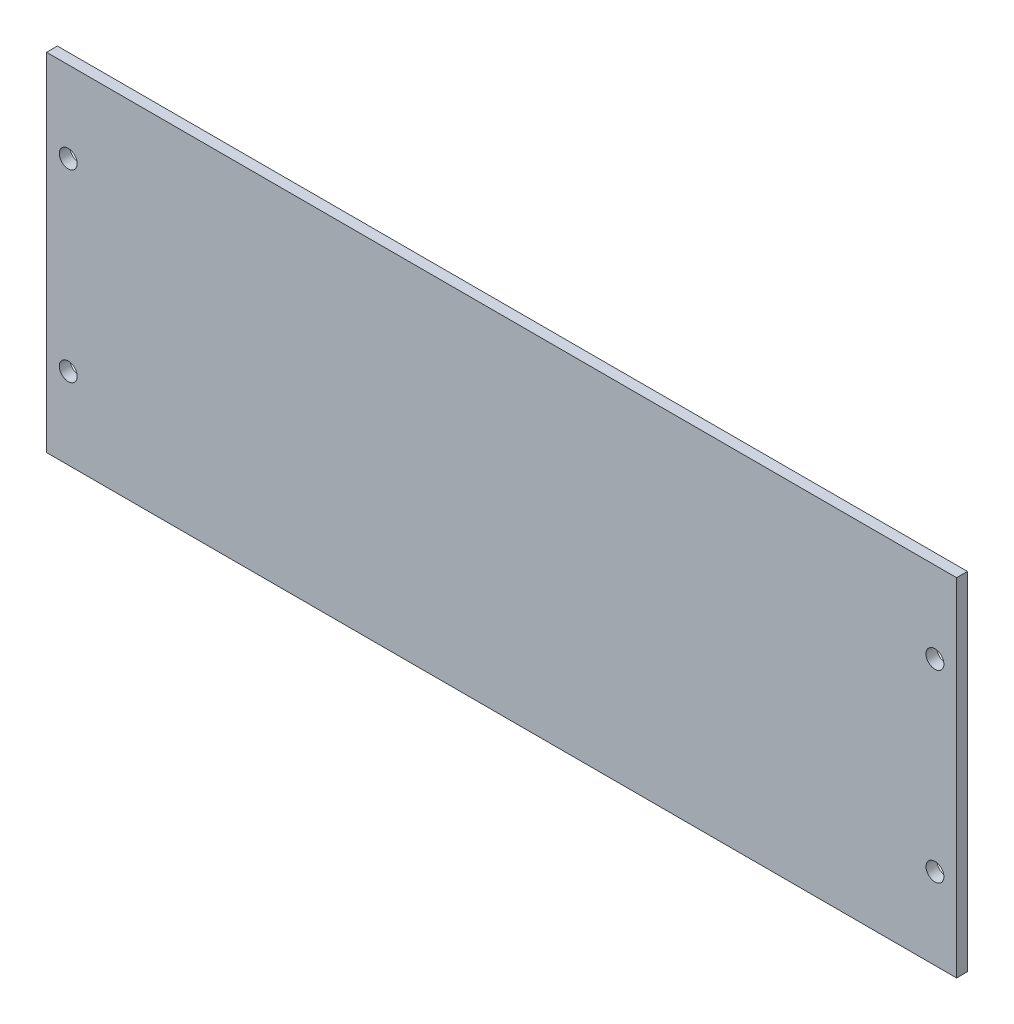
ISO-10303-21;
HEADER;
FILE_DESCRIPTION(('STEP AP214'),'2;1');
FILE_NAME('part.step','',(''),(''),'','','');
FILE_SCHEMA(('AUTOMOTIVE_DESIGN { 1 0 10303 214 1 1 1 1 }'));
ENDSEC;
DATA;
#1=APPLICATION_CONTEXT('core data for automotive mechanical design processes');
#2=APPLICATION_PROTOCOL_DEFINITION('international standard','automotive_design',2000,#1);
#3=PRODUCT_CONTEXT('',#1,'mechanical');
#4=PRODUCT('Part','Part','',(#3));
#5=PRODUCT_RELATED_PRODUCT_CATEGORY('part','',(#4));
#6=PRODUCT_DEFINITION_FORMATION('','',#4);
#7=PRODUCT_DEFINITION_CONTEXT('part definition',#1,'design');
#8=PRODUCT_DEFINITION('design','',#6,#7);
#9=PRODUCT_DEFINITION_SHAPE('','',#8);
#10=(LENGTH_UNIT() NAMED_UNIT(*) SI_UNIT(.MILLI.,.METRE.));
#11=(NAMED_UNIT(*) PLANE_ANGLE_UNIT() SI_UNIT($,.RADIAN.));
#12=(NAMED_UNIT(*) SI_UNIT($,.STERADIAN.) SOLID_ANGLE_UNIT());
#13=UNCERTAINTY_MEASURE_WITH_UNIT(LENGTH_MEASURE(1.E-05),#10,'distance_accuracy_value','');
#14=(GEOMETRIC_REPRESENTATION_CONTEXT(3) GLOBAL_UNCERTAINTY_ASSIGNED_CONTEXT((#13)) GLOBAL_UNIT_ASSIGNED_CONTEXT((#10,
#11,#12)) REPRESENTATION_CONTEXT('',''));
#15=CARTESIAN_POINT('',(0.,0.,0.));
#16=DIRECTION('',(0.,0.,1.));
#17=DIRECTION('',(1.,0.,0.));
#18=AXIS2_PLACEMENT_3D('',#15,#16,#17);
#19=CARTESIAN_POINT('',(168.,-64.,4.));
#20=DIRECTION('',(-1.,0.,0.));
#21=DIRECTION('',(0.,0.,1.));
#22=AXIS2_PLACEMENT_3D('',#19,#20,#21);
#23=PLANE('',#22);
#24=DIRECTION('',(0.,1.,0.));
#25=VECTOR('',#24,1.);
#26=CARTESIAN_POINT('',(168.,-64.,0.));
#27=LINE('',#26,#25);
#28=CARTESIAN_POINT('',(168.,-64.,0.));
#29=VERTEX_POINT('',#28);
#30=CARTESIAN_POINT('',(168.,64.,0.));
#31=VERTEX_POINT('',#30);
#32=EDGE_CURVE('E95',#29,#31,#27,.T.);
#33=ORIENTED_EDGE('',*,*,#32,.T.);
#34=DIRECTION('',(0.,0.,-1.));
#35=VECTOR('',#34,1.);
#36=CARTESIAN_POINT('',(168.,64.,4.));
#37=LINE('',#36,#35);
#38=CARTESIAN_POINT('',(168.,64.,4.));
#39=VERTEX_POINT('',#38);
#40=EDGE_CURVE('E11',#39,#31,#37,.T.);
#41=ORIENTED_EDGE('',*,*,#40,.F.);
#42=DIRECTION('',(0.,1.,0.));
#43=VECTOR('',#42,1.);
#44=CARTESIAN_POINT('',(168.,-64.,4.));
#45=LINE('',#44,#43);
#46=CARTESIAN_POINT('',(168.,-64.,4.));
#47=VERTEX_POINT('',#46);
#48=EDGE_CURVE('E83',#47,#39,#45,.T.);
#49=ORIENTED_EDGE('',*,*,#48,.F.);
#50=DIRECTION('',(0.,0.,-1.));
#51=VECTOR('',#50,1.);
#52=CARTESIAN_POINT('',(168.,-64.,4.));
#53=LINE('',#52,#51);
#54=EDGE_CURVE('E91',#47,#29,#53,.T.);
#55=ORIENTED_EDGE('',*,*,#54,.T.);
#56=EDGE_LOOP('',(#33,#41,#49,#55));
#57=FACE_BOUND('',#56,.T.);
#58=ADVANCED_FACE('F32',(#57),#23,.F.);
#59=CARTESIAN_POINT('',(-168.,64.,4.));
#60=DIRECTION('',(0.,-1.,0.));
#61=DIRECTION('',(0.,0.,-1.));
#62=AXIS2_PLACEMENT_3D('',#59,#60,#61);
#63=PLANE('',#62);
#64=DIRECTION('',(-1.,0.,0.));
#65=VECTOR('',#64,1.);
#66=CARTESIAN_POINT('',(-168.,64.,0.));
#67=LINE('',#66,#65);
#68=CARTESIAN_POINT('',(-168.,64.,0.));
#69=VERTEX_POINT('',#68);
#70=EDGE_CURVE('E87',#31,#69,#67,.T.);
#71=ORIENTED_EDGE('',*,*,#70,.T.);
#72=DIRECTION('',(0.,0.,-1.));
#73=VECTOR('',#72,1.);
#74=CARTESIAN_POINT('',(-168.,64.,4.));
#75=LINE('',#74,#73);
#76=CARTESIAN_POINT('',(-168.,64.,4.));
#77=VERTEX_POINT('',#76);
#78=EDGE_CURVE('E40',#77,#69,#75,.T.);
#79=ORIENTED_EDGE('',*,*,#78,.F.);
#80=DIRECTION('',(-1.,0.,0.));
#81=VECTOR('',#80,1.);
#82=CARTESIAN_POINT('',(-168.,64.,4.));
#83=LINE('',#82,#81);
#84=EDGE_CURVE('E78',#39,#77,#83,.T.);
#85=ORIENTED_EDGE('',*,*,#84,.F.);
#86=ORIENTED_EDGE('',*,*,#40,.T.);
#87=EDGE_LOOP('',(#71,#79,#85,#86));
#88=FACE_BOUND('',#87,.T.);
#89=ADVANCED_FACE('F86',(#88),#63,.F.);
#90=CARTESIAN_POINT('',(-168.,-64.,4.));
#91=DIRECTION('',(1.,0.,0.));
#92=DIRECTION('',(0.,0.,-1.));
#93=AXIS2_PLACEMENT_3D('',#90,#91,#92);
#94=PLANE('',#93);
#95=DIRECTION('',(0.,-1.,0.));
#96=VECTOR('',#95,1.);
#97=CARTESIAN_POINT('',(-168.,-64.,0.));
#98=LINE('',#97,#96);
#99=CARTESIAN_POINT('',(-168.,-64.,0.));
#100=VERTEX_POINT('',#99);
#101=EDGE_CURVE('E65',#69,#100,#98,.T.);
#102=ORIENTED_EDGE('',*,*,#101,.T.);
#103=DIRECTION('',(0.,0.,-1.));
#104=VECTOR('',#103,1.);
#105=CARTESIAN_POINT('',(-168.,-64.,4.));
#106=LINE('',#105,#104);
#107=CARTESIAN_POINT('',(-168.,-64.,4.));
#108=VERTEX_POINT('',#107);
#109=EDGE_CURVE('E88',#108,#100,#106,.T.);
#110=ORIENTED_EDGE('',*,*,#109,.F.);
#111=DIRECTION('',(0.,-1.,0.));
#112=VECTOR('',#111,1.);
#113=CARTESIAN_POINT('',(-168.,-64.,4.));
#114=LINE('',#113,#112);
#115=EDGE_CURVE('E81',#77,#108,#114,.T.);
#116=ORIENTED_EDGE('',*,*,#115,.F.);
#117=ORIENTED_EDGE('',*,*,#78,.T.);
#118=EDGE_LOOP('',(#102,#110,#116,#117));
#119=FACE_BOUND('',#118,.T.);
#120=ADVANCED_FACE('F89',(#119),#94,.F.);
#121=CARTESIAN_POINT('',(-168.,-64.,4.));
#122=DIRECTION('',(0.,1.,0.));
#123=DIRECTION('',(0.,0.,1.));
#124=AXIS2_PLACEMENT_3D('',#121,#122,#123);
#125=PLANE('',#124);
#126=DIRECTION('',(1.,0.,0.));
#127=VECTOR('',#126,1.);
#128=CARTESIAN_POINT('',(-168.,-64.,0.));
#129=LINE('',#128,#127);
#130=EDGE_CURVE('E71',#100,#29,#129,.T.);
#131=ORIENTED_EDGE('',*,*,#130,.T.);
#132=ORIENTED_EDGE('',*,*,#54,.F.);
#133=DIRECTION('',(1.,0.,0.));
#134=VECTOR('',#133,1.);
#135=CARTESIAN_POINT('',(-168.,-64.,4.));
#136=LINE('',#135,#134);
#137=EDGE_CURVE('E48',#108,#47,#136,.T.);
#138=ORIENTED_EDGE('',*,*,#137,.F.);
#139=ORIENTED_EDGE('',*,*,#109,.T.);
#140=EDGE_LOOP('',(#131,#132,#138,#139));
#141=FACE_BOUND('',#140,.T.);
#142=ADVANCED_FACE('F103',(#141),#125,.F.);
#143=CARTESIAN_POINT('',(0.,0.,4.));
#144=DIRECTION('',(0.,0.,-1.));
#145=DIRECTION('',(-1.,0.,0.));
#146=AXIS2_PLACEMENT_3D('',#143,#144,#145);
#147=PLANE('',#146);
#148=CARTESIAN_POINT('',(-160.,34.,4.));
#149=DIRECTION('',(0.,0.,-1.));
#150=DIRECTION('',(-1.,0.,0.));
#151=AXIS2_PLACEMENT_3D('',#148,#149,#150);
#152=CIRCLE('',#151,3.3);
#153=CARTESIAN_POINT('',(-163.3,34.,4.));
#154=VERTEX_POINT('',#153);
#155=EDGE_CURVE('E126',#154,#154,#152,.T.);
#156=ORIENTED_EDGE('',*,*,#155,.T.);
#157=EDGE_LOOP('',(#156));
#158=FACE_BOUND('',#157,.T.);
#159=CARTESIAN_POINT('',(-160.,-34.,4.));
#160=DIRECTION('',(0.,0.,-1.));
#161=DIRECTION('',(-1.,0.,0.));
#162=AXIS2_PLACEMENT_3D('',#159,#160,#161);
#163=CIRCLE('',#162,3.3);
#164=CARTESIAN_POINT('',(-163.3,-34.,4.));
#165=VERTEX_POINT('',#164);
#166=EDGE_CURVE('E120',#165,#165,#163,.T.);
#167=ORIENTED_EDGE('',*,*,#166,.T.);
#168=EDGE_LOOP('',(#167));
#169=FACE_BOUND('',#168,.T.);
#170=CARTESIAN_POINT('',(160.,-34.,4.));
#171=DIRECTION('',(0.,0.,-1.));
#172=DIRECTION('',(-1.,0.,0.));
#173=AXIS2_PLACEMENT_3D('',#170,#171,#172);
#174=CIRCLE('',#173,3.3);
#175=CARTESIAN_POINT('',(156.7,-34.,4.));
#176=VERTEX_POINT('',#175);
#177=EDGE_CURVE('E114',#176,#176,#174,.T.);
#178=ORIENTED_EDGE('',*,*,#177,.T.);
#179=EDGE_LOOP('',(#178));
#180=FACE_BOUND('',#179,.T.);
#181=CARTESIAN_POINT('',(160.,34.,4.));
#182=DIRECTION('',(0.,0.,-1.));
#183=DIRECTION('',(-1.,0.,0.));
#184=AXIS2_PLACEMENT_3D('',#181,#182,#183);
#185=CIRCLE('',#184,3.3);
#186=CARTESIAN_POINT('',(156.7,34.,4.));
#187=VERTEX_POINT('',#186);
#188=EDGE_CURVE('E98',#187,#187,#185,.T.);
#189=ORIENTED_EDGE('',*,*,#188,.T.);
#190=EDGE_LOOP('',(#189));
#191=FACE_BOUND('',#190,.T.);
#192=ORIENTED_EDGE('',*,*,#48,.T.);
#193=ORIENTED_EDGE('',*,*,#84,.T.);
#194=ORIENTED_EDGE('',*,*,#115,.T.);
#195=ORIENTED_EDGE('',*,*,#137,.T.);
#196=EDGE_LOOP('',(#192,#193,#194,#195));
#197=FACE_BOUND('',#196,.T.);
#198=ADVANCED_FACE('F79',(#158,#169,#180,#191,#197),#147,.F.);
#199=CARTESIAN_POINT('',(0.,0.,0.));
#200=DIRECTION('',(0.,0.,-1.));
#201=DIRECTION('',(-1.,0.,0.));
#202=AXIS2_PLACEMENT_3D('',#199,#200,#201);
#203=PLANE('',#202);
#204=CARTESIAN_POINT('',(-160.,34.,0.));
#205=DIRECTION('',(0.,0.,-1.));
#206=DIRECTION('',(-1.,0.,0.));
#207=AXIS2_PLACEMENT_3D('',#204,#205,#206);
#208=CIRCLE('',#207,3.3);
#209=CARTESIAN_POINT('',(-163.3,34.,0.));
#210=VERTEX_POINT('',#209);
#211=EDGE_CURVE('E129',#210,#210,#208,.T.);
#212=ORIENTED_EDGE('',*,*,#211,.F.);
#213=EDGE_LOOP('',(#212));
#214=FACE_BOUND('',#213,.T.);
#215=CARTESIAN_POINT('',(-160.,-34.,0.));
#216=DIRECTION('',(0.,0.,-1.));
#217=DIRECTION('',(-1.,0.,0.));
#218=AXIS2_PLACEMENT_3D('',#215,#216,#217);
#219=CIRCLE('',#218,3.3);
#220=CARTESIAN_POINT('',(-163.3,-34.,0.));
#221=VERTEX_POINT('',#220);
#222=EDGE_CURVE('E123',#221,#221,#219,.T.);
#223=ORIENTED_EDGE('',*,*,#222,.F.);
#224=EDGE_LOOP('',(#223));
#225=FACE_BOUND('',#224,.T.);
#226=CARTESIAN_POINT('',(160.,-34.,0.));
#227=DIRECTION('',(0.,0.,-1.));
#228=DIRECTION('',(-1.,0.,0.));
#229=AXIS2_PLACEMENT_3D('',#226,#227,#228);
#230=CIRCLE('',#229,3.3);
#231=CARTESIAN_POINT('',(156.7,-34.,0.));
#232=VERTEX_POINT('',#231);
#233=EDGE_CURVE('E117',#232,#232,#230,.T.);
#234=ORIENTED_EDGE('',*,*,#233,.F.);
#235=EDGE_LOOP('',(#234));
#236=FACE_BOUND('',#235,.T.);
#237=CARTESIAN_POINT('',(160.,34.,0.));
#238=DIRECTION('',(0.,0.,-1.));
#239=DIRECTION('',(-1.,0.,0.));
#240=AXIS2_PLACEMENT_3D('',#237,#238,#239);
#241=CIRCLE('',#240,3.3);
#242=CARTESIAN_POINT('',(156.7,34.,0.));
#243=VERTEX_POINT('',#242);
#244=EDGE_CURVE('E111',#243,#243,#241,.T.);
#245=ORIENTED_EDGE('',*,*,#244,.F.);
#246=EDGE_LOOP('',(#245));
#247=FACE_BOUND('',#246,.T.);
#248=ORIENTED_EDGE('',*,*,#32,.F.);
#249=ORIENTED_EDGE('',*,*,#130,.F.);
#250=ORIENTED_EDGE('',*,*,#101,.F.);
#251=ORIENTED_EDGE('',*,*,#70,.F.);
#252=EDGE_LOOP('',(#248,#249,#250,#251));
#253=FACE_BOUND('',#252,.T.);
#254=ADVANCED_FACE('F106',(#214,#225,#236,#247,#253),#203,.T.);
#255=CARTESIAN_POINT('',(160.,34.,0.));
#256=DIRECTION('',(0.,0.,-1.));
#257=DIRECTION('',(-1.,0.,0.));
#258=AXIS2_PLACEMENT_3D('',#255,#256,#257);
#259=CYLINDRICAL_SURFACE('',#258,3.3);
#260=ORIENTED_EDGE('',*,*,#188,.F.);
#261=EDGE_LOOP('',(#260));
#262=FACE_BOUND('',#261,.T.);
#263=ORIENTED_EDGE('',*,*,#244,.T.);
#264=EDGE_LOOP('',(#263));
#265=FACE_BOUND('',#264,.T.);
#266=ADVANCED_FACE('F137',(#262,#265),#259,.F.);
#267=CARTESIAN_POINT('',(160.,-34.,0.));
#268=DIRECTION('',(0.,0.,-1.));
#269=DIRECTION('',(-1.,0.,0.));
#270=AXIS2_PLACEMENT_3D('',#267,#268,#269);
#271=CYLINDRICAL_SURFACE('',#270,3.3);
#272=ORIENTED_EDGE('',*,*,#177,.F.);
#273=EDGE_LOOP('',(#272));
#274=FACE_BOUND('',#273,.T.);
#275=ORIENTED_EDGE('',*,*,#233,.T.);
#276=EDGE_LOOP('',(#275));
#277=FACE_BOUND('',#276,.T.);
#278=ADVANCED_FACE('F146',(#274,#277),#271,.F.);
#279=CARTESIAN_POINT('',(-160.,-34.,0.));
#280=DIRECTION('',(0.,0.,-1.));
#281=DIRECTION('',(-1.,0.,0.));
#282=AXIS2_PLACEMENT_3D('',#279,#280,#281);
#283=CYLINDRICAL_SURFACE('',#282,3.3);
#284=ORIENTED_EDGE('',*,*,#166,.F.);
#285=EDGE_LOOP('',(#284));
#286=FACE_BOUND('',#285,.T.);
#287=ORIENTED_EDGE('',*,*,#222,.T.);
#288=EDGE_LOOP('',(#287));
#289=FACE_BOUND('',#288,.T.);
#290=ADVANCED_FACE('F152',(#286,#289),#283,.F.);
#291=CARTESIAN_POINT('',(-160.,34.,0.));
#292=DIRECTION('',(0.,0.,-1.));
#293=DIRECTION('',(-1.,0.,0.));
#294=AXIS2_PLACEMENT_3D('',#291,#292,#293);
#295=CYLINDRICAL_SURFACE('',#294,3.3);
#296=ORIENTED_EDGE('',*,*,#155,.F.);
#297=EDGE_LOOP('',(#296));
#298=FACE_BOUND('',#297,.T.);
#299=ORIENTED_EDGE('',*,*,#211,.T.);
#300=EDGE_LOOP('',(#299));
#301=FACE_BOUND('',#300,.T.);
#302=ADVANCED_FACE('F133',(#298,#301),#295,.F.);
#303=CLOSED_SHELL('',(#58,#89,#120,#142,#198,#254,#266,#278,#290,#302));
#304=MANIFOLD_SOLID_BREP('B2',#303);
#305=ADVANCED_BREP_SHAPE_REPRESENTATION('',(#18,#304),#14);
#306=SHAPE_DEFINITION_REPRESENTATION(#9,#305);
ENDSEC;
END-ISO-10303-21;
